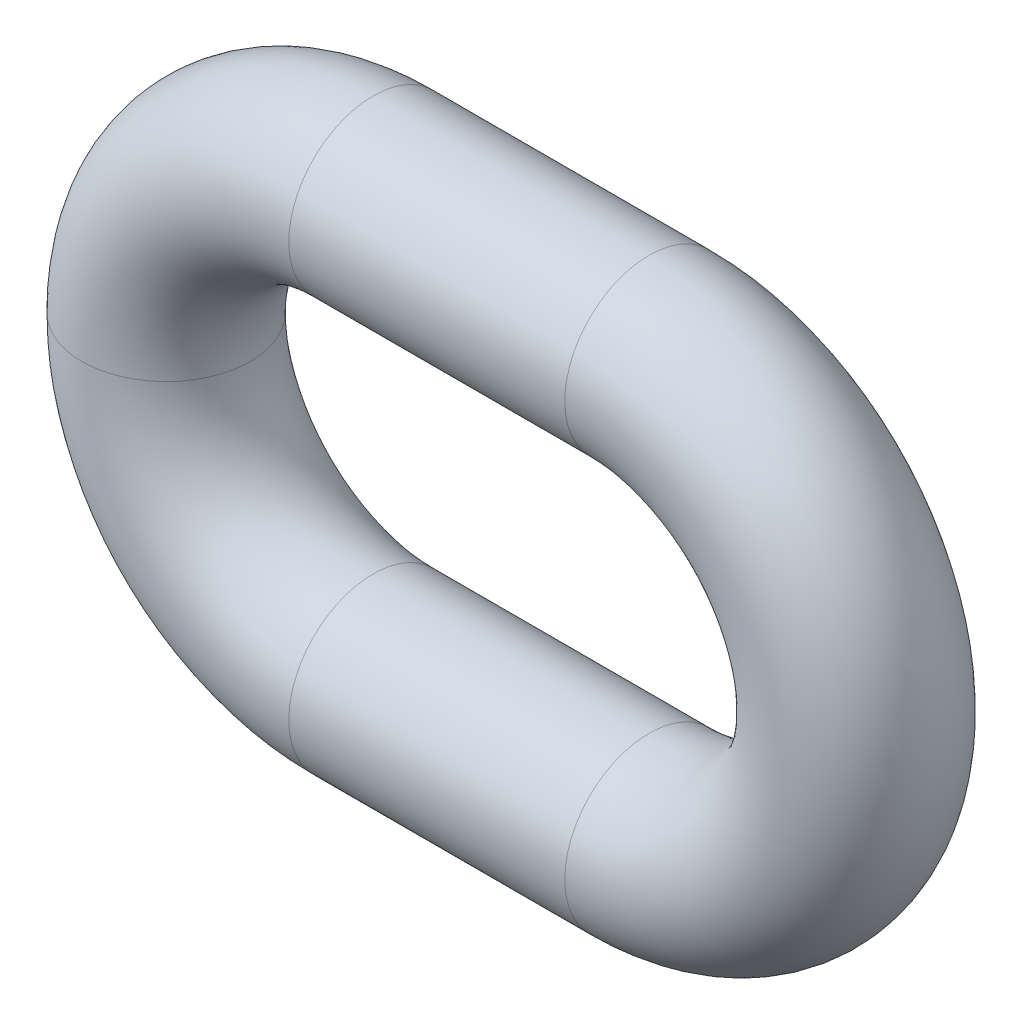
ISO-10303-21;
HEADER;
FILE_DESCRIPTION(('STEP AP214'),'2;1');
FILE_NAME('part.step','',(''),(''),'','','');
FILE_SCHEMA(('AUTOMOTIVE_DESIGN { 1 0 10303 214 1 1 1 1 }'));
ENDSEC;
DATA;
#1=APPLICATION_CONTEXT('core data for automotive mechanical design processes');
#2=APPLICATION_PROTOCOL_DEFINITION('international standard','automotive_design',2000,#1);
#3=PRODUCT_CONTEXT('',#1,'mechanical');
#4=PRODUCT('Part','Part','',(#3));
#5=PRODUCT_RELATED_PRODUCT_CATEGORY('part','',(#4));
#6=PRODUCT_DEFINITION_FORMATION('','',#4);
#7=PRODUCT_DEFINITION_CONTEXT('part definition',#1,'design');
#8=PRODUCT_DEFINITION('design','',#6,#7);
#9=PRODUCT_DEFINITION_SHAPE('','',#8);
#10=(LENGTH_UNIT() NAMED_UNIT(*) SI_UNIT(.MILLI.,.METRE.));
#11=(NAMED_UNIT(*) PLANE_ANGLE_UNIT() SI_UNIT($,.RADIAN.));
#12=(NAMED_UNIT(*) SI_UNIT($,.STERADIAN.) SOLID_ANGLE_UNIT());
#13=UNCERTAINTY_MEASURE_WITH_UNIT(LENGTH_MEASURE(1.E-05),#10,'distance_accuracy_value','');
#14=(GEOMETRIC_REPRESENTATION_CONTEXT(3) GLOBAL_UNCERTAINTY_ASSIGNED_CONTEXT((#13)) GLOBAL_UNIT_ASSIGNED_CONTEXT((#10,
#11,#12)) REPRESENTATION_CONTEXT('',''));
#15=CARTESIAN_POINT('',(0.,0.,0.));
#16=DIRECTION('',(0.,0.,1.));
#17=DIRECTION('',(1.,0.,0.));
#18=AXIS2_PLACEMENT_3D('',#15,#16,#17);
#19=CARTESIAN_POINT('',(4.064,0.,0.));
#20=DIRECTION('',(0.,0.,-1.));
#21=DIRECTION('',(-1.,0.,0.));
#22=AXIS2_PLACEMENT_3D('',#19,#20,#21);
#23=TOROIDAL_SURFACE('',#22,6.858,2.794);
#24=CARTESIAN_POINT('',(4.064,-6.858,0.));
#25=DIRECTION('',(-1.,0.,0.));
#26=DIRECTION('',(0.,0.,1.));
#27=AXIS2_PLACEMENT_3D('',#24,#25,#26);
#28=CIRCLE('',#27,2.794);
#29=CARTESIAN_POINT('',(4.064,-9.652,0.));
#30=VERTEX_POINT('',#29);
#31=EDGE_CURVE('E10',#30,#30,#28,.T.);
#32=CARTESIAN_POINT('',(-2.794,0.,0.));
#33=DIRECTION('',(0.,1.,0.));
#34=DIRECTION('',(0.,0.,1.));
#35=AXIS2_PLACEMENT_3D('',#32,#33,#34);
#36=CIRCLE('',#35,2.794);
#37=CARTESIAN_POINT('',(-5.588,0.,0.));
#38=VERTEX_POINT('',#37);
#39=EDGE_CURVE('E49',#38,#38,#36,.T.);
#40=CARTESIAN_POINT('',(4.064,0.,0.));
#41=DIRECTION('',(0.,0.,-1.));
#42=DIRECTION('',(-1.,0.,0.));
#43=AXIS2_PLACEMENT_3D('',#40,#41,#42);
#44=CIRCLE('',#43,9.652);
#45=EDGE_CURVE('',#30,#38,#44,.T.);
#46=ORIENTED_EDGE('',*,*,#31,.T.);
#47=ORIENTED_EDGE('',*,*,#39,.F.);
#48=ORIENTED_EDGE('',*,*,#45,.T.);
#49=ORIENTED_EDGE('',*,*,#45,.F.);
#50=EDGE_LOOP('',(#46,#48,#47,#49));
#51=FACE_BOUND('',#50,.T.);
#52=ADVANCED_FACE('F30',(#51),#23,.T.);
#53=CARTESIAN_POINT('',(13.208,-6.858,0.));
#54=DIRECTION('',(-1.,0.,0.));
#55=DIRECTION('',(0.,-1.,0.));
#56=AXIS2_PLACEMENT_3D('',#53,#54,#55);
#57=CYLINDRICAL_SURFACE('',#56,2.794);
#58=CARTESIAN_POINT('',(13.208,-6.858,0.));
#59=DIRECTION('',(-1.,0.,0.));
#60=DIRECTION('',(0.,0.,1.));
#61=AXIS2_PLACEMENT_3D('',#58,#59,#60);
#62=CIRCLE('',#61,2.794);
#63=CARTESIAN_POINT('',(13.208,-9.652,0.));
#64=VERTEX_POINT('',#63);
#65=EDGE_CURVE('E36',#64,#64,#62,.T.);
#66=CARTESIAN_POINT('',(4.064,-9.652,0.));
#67=CARTESIAN_POINT('',(4.15925,-9.652,0.));
#68=CARTESIAN_POINT('',(4.2545,-9.652,0.));
#69=CARTESIAN_POINT('',(4.445,-9.652,0.));
#70=CARTESIAN_POINT('',(4.54025,-9.652,0.));
#71=CARTESIAN_POINT('',(4.73075,-9.652,0.));
#72=CARTESIAN_POINT('',(4.826,-9.652,0.));
#73=CARTESIAN_POINT('',(5.0165,-9.652,0.));
#74=CARTESIAN_POINT('',(5.11175,-9.652,0.));
#75=CARTESIAN_POINT('',(5.30225,-9.652,0.));
#76=CARTESIAN_POINT('',(5.3975,-9.652,0.));
#77=CARTESIAN_POINT('',(5.588,-9.652,0.));
#78=CARTESIAN_POINT('',(5.68325,-9.652,0.));
#79=CARTESIAN_POINT('',(5.87375,-9.652,0.));
#80=CARTESIAN_POINT('',(5.969,-9.652,0.));
#81=CARTESIAN_POINT('',(6.1595,-9.652,0.));
#82=CARTESIAN_POINT('',(6.25475,-9.652,0.));
#83=CARTESIAN_POINT('',(6.44525,-9.652,0.));
#84=CARTESIAN_POINT('',(6.5405,-9.652,0.));
#85=CARTESIAN_POINT('',(6.731,-9.652,0.));
#86=CARTESIAN_POINT('',(6.82625,-9.652,0.));
#87=CARTESIAN_POINT('',(7.01675,-9.652,0.));
#88=CARTESIAN_POINT('',(7.112,-9.652,0.));
#89=CARTESIAN_POINT('',(7.3025,-9.652,0.));
#90=CARTESIAN_POINT('',(7.39775,-9.652,0.));
#91=CARTESIAN_POINT('',(7.58825,-9.652,0.));
#92=CARTESIAN_POINT('',(7.6835,-9.652,0.));
#93=CARTESIAN_POINT('',(7.874,-9.652,0.));
#94=CARTESIAN_POINT('',(7.96925,-9.652,0.));
#95=CARTESIAN_POINT('',(8.15975,-9.652,0.));
#96=CARTESIAN_POINT('',(8.255,-9.652,0.));
#97=CARTESIAN_POINT('',(8.4455,-9.652,0.));
#98=CARTESIAN_POINT('',(8.54075,-9.652,0.));
#99=CARTESIAN_POINT('',(8.73125,-9.652,0.));
#100=CARTESIAN_POINT('',(8.8265,-9.652,0.));
#101=CARTESIAN_POINT('',(9.017,-9.652,0.));
#102=CARTESIAN_POINT('',(9.11225,-9.652,0.));
#103=CARTESIAN_POINT('',(9.30275,-9.652,0.));
#104=CARTESIAN_POINT('',(9.398,-9.652,0.));
#105=CARTESIAN_POINT('',(9.5885,-9.652,0.));
#106=CARTESIAN_POINT('',(9.68375,-9.652,0.));
#107=CARTESIAN_POINT('',(9.87425,-9.652,0.));
#108=CARTESIAN_POINT('',(9.9695,-9.652,0.));
#109=CARTESIAN_POINT('',(10.16,-9.652,0.));
#110=CARTESIAN_POINT('',(10.25525,-9.652,0.));
#111=CARTESIAN_POINT('',(10.44575,-9.652,0.));
#112=CARTESIAN_POINT('',(10.541,-9.652,0.));
#113=CARTESIAN_POINT('',(10.7315,-9.652,0.));
#114=CARTESIAN_POINT('',(10.82675,-9.652,0.));
#115=CARTESIAN_POINT('',(11.01725,-9.652,0.));
#116=CARTESIAN_POINT('',(11.1125,-9.652,0.));
#117=CARTESIAN_POINT('',(11.303,-9.652,0.));
#118=CARTESIAN_POINT('',(11.39825,-9.652,0.));
#119=CARTESIAN_POINT('',(11.58875,-9.652,0.));
#120=CARTESIAN_POINT('',(11.684,-9.652,0.));
#121=CARTESIAN_POINT('',(11.8745,-9.652,0.));
#122=CARTESIAN_POINT('',(11.96975,-9.652,0.));
#123=CARTESIAN_POINT('',(12.16025,-9.652,0.));
#124=CARTESIAN_POINT('',(12.2555,-9.652,0.));
#125=CARTESIAN_POINT('',(12.446,-9.652,0.));
#126=CARTESIAN_POINT('',(12.54125,-9.652,0.));
#127=CARTESIAN_POINT('',(12.73175,-9.652,0.));
#128=CARTESIAN_POINT('',(12.827,-9.652,0.));
#129=CARTESIAN_POINT('',(13.0175,-9.652,0.));
#130=CARTESIAN_POINT('',(13.11275,-9.652,0.));
#131=CARTESIAN_POINT('',(13.208,-9.652,0.));
#132=B_SPLINE_CURVE_WITH_KNOTS('',3,(#66,#67,#68,#69,#70,#71,#72,#73,#74,#75,#76,#77,#78,#79,
#80,#81,#82,#83,#84,#85,#86,#87,#88,#89,#90,#91,#92,#93,#94,#95,#96,#97,#98,#99,#100,#101,#102,
#103,#104,#105,#106,#107,#108,#109,#110,#111,#112,#113,#114,#115,#116,#117,#118,#119,#120,#121,
#122,#123,#124,#125,#126,#127,#128,#129,#130,#131),.UNSPECIFIED.,.F.,.F.,(4,2,2,2,2,2,2,2,2,2,2,
2,2,2,2,2,2,2,2,2,2,2,2,2,2,2,2,2,2,2,2,2,4),(0.,0.28575,0.571500000000001,0.85725,1.143,
1.42875,1.7145,2.00025,2.286,2.57175,2.8575,3.14325,3.429,3.71475,4.0005,4.28625,4.572,4.85775,
5.1435,5.42925,5.715,6.00075,6.2865,6.57225,6.858,7.14375,7.4295,7.71525,8.001,8.28675,8.5725,
8.85825000000001,9.144),.UNSPECIFIED.);
#133=EDGE_CURVE('BSEAM56',#30,#64,#132,.T.);
#134=ORIENTED_EDGE('',*,*,#31,.F.);
#135=ORIENTED_EDGE('',*,*,#65,.T.);
#136=ORIENTED_EDGE('',*,*,#133,.T.);
#137=ORIENTED_EDGE('',*,*,#133,.F.);
#138=EDGE_LOOP('',(#134,#136,#135,#137));
#139=FACE_BOUND('',#138,.T.);
#140=ADVANCED_FACE('F56',(#139),#57,.T.);
#141=CARTESIAN_POINT('',(13.208,0.,0.));
#142=DIRECTION('',(0.,0.,-1.));
#143=DIRECTION('',(-1.,0.,0.));
#144=AXIS2_PLACEMENT_3D('',#141,#142,#143);
#145=TOROIDAL_SURFACE('',#144,6.858,2.794);
#146=CARTESIAN_POINT('',(13.208,6.858,0.));
#147=DIRECTION('',(1.,0.,0.));
#148=DIRECTION('',(0.,0.,1.));
#149=AXIS2_PLACEMENT_3D('',#146,#147,#148);
#150=CIRCLE('',#149,2.794);
#151=CARTESIAN_POINT('',(13.208,9.652,0.));
#152=VERTEX_POINT('',#151);
#153=EDGE_CURVE('E40',#152,#152,#150,.T.);
#154=CARTESIAN_POINT('',(13.208,0.,0.));
#155=DIRECTION('',(0.,0.,-1.));
#156=DIRECTION('',(-1.,0.,0.));
#157=AXIS2_PLACEMENT_3D('',#154,#155,#156);
#158=CIRCLE('',#157,9.652);
#159=EDGE_CURVE('',#152,#64,#158,.T.);
#160=ORIENTED_EDGE('',*,*,#153,.T.);
#161=ORIENTED_EDGE('',*,*,#65,.F.);
#162=ORIENTED_EDGE('',*,*,#159,.T.);
#163=ORIENTED_EDGE('',*,*,#159,.F.);
#164=EDGE_LOOP('',(#160,#162,#161,#163));
#165=FACE_BOUND('',#164,.T.);
#166=ADVANCED_FACE('F60',(#165),#145,.T.);
#167=CARTESIAN_POINT('',(4.064,6.858,0.));
#168=DIRECTION('',(1.,0.,0.));
#169=DIRECTION('',(0.,1.,0.));
#170=AXIS2_PLACEMENT_3D('',#167,#168,#169);
#171=CYLINDRICAL_SURFACE('',#170,2.794);
#172=ORIENTED_EDGE('',*,*,#153,.F.);
#173=EDGE_LOOP('',(#172));
#174=FACE_BOUND('',#173,.T.);
#175=CARTESIAN_POINT('',(4.064,6.858,0.));
#176=DIRECTION('',(1.,0.,0.));
#177=DIRECTION('',(0.,0.,1.));
#178=AXIS2_PLACEMENT_3D('',#175,#176,#177);
#179=CIRCLE('',#178,2.794);
#180=CARTESIAN_POINT('',(4.064,9.652,0.));
#181=VERTEX_POINT('',#180);
#182=EDGE_CURVE('E44',#181,#181,#179,.T.);
#183=ORIENTED_EDGE('',*,*,#182,.T.);
#184=EDGE_LOOP('',(#183));
#185=FACE_BOUND('',#184,.T.);
#186=ADVANCED_FACE('F65',(#174,#185),#171,.T.);
#187=CARTESIAN_POINT('',(4.064,0.,0.));
#188=DIRECTION('',(0.,0.,-1.));
#189=DIRECTION('',(-1.,0.,0.));
#190=AXIS2_PLACEMENT_3D('',#187,#188,#189);
#191=TOROIDAL_SURFACE('',#190,6.858,2.794);
#192=CARTESIAN_POINT('',(4.064,0.,0.));
#193=DIRECTION('',(0.,0.,-1.));
#194=DIRECTION('',(-1.,0.,0.));
#195=AXIS2_PLACEMENT_3D('',#192,#193,#194);
#196=CIRCLE('',#195,9.652);
#197=EDGE_CURVE('',#38,#181,#196,.T.);
#198=ORIENTED_EDGE('',*,*,#39,.T.);
#199=ORIENTED_EDGE('',*,*,#182,.F.);
#200=ORIENTED_EDGE('',*,*,#197,.T.);
#201=ORIENTED_EDGE('',*,*,#197,.F.);
#202=EDGE_LOOP('',(#198,#200,#199,#201));
#203=FACE_BOUND('',#202,.T.);
#204=ADVANCED_FACE('F53',(#203),#191,.T.);
#205=CLOSED_SHELL('',(#52,#140,#166,#186,#204));
#206=MANIFOLD_SOLID_BREP('B2',#205);
#207=ADVANCED_BREP_SHAPE_REPRESENTATION('',(#18,#206),#14);
#208=SHAPE_DEFINITION_REPRESENTATION(#9,#207);
ENDSEC;
END-ISO-10303-21;
